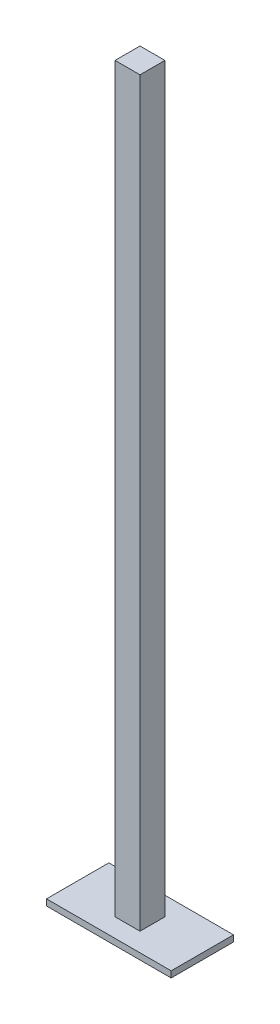
ISO-10303-21;
HEADER;
FILE_DESCRIPTION(('STEP AP214'),'2;1');
FILE_NAME('part.step','',(''),(''),'','','');
FILE_SCHEMA(('AUTOMOTIVE_DESIGN { 1 0 10303 214 1 1 1 1 }'));
ENDSEC;
DATA;
#1=APPLICATION_CONTEXT('core data for automotive mechanical design processes');
#2=APPLICATION_PROTOCOL_DEFINITION('international standard','automotive_design',2000,#1);
#3=PRODUCT_CONTEXT('',#1,'mechanical');
#4=PRODUCT('Part','Part','',(#3));
#5=PRODUCT_RELATED_PRODUCT_CATEGORY('part','',(#4));
#6=PRODUCT_DEFINITION_FORMATION('','',#4);
#7=PRODUCT_DEFINITION_CONTEXT('part definition',#1,'design');
#8=PRODUCT_DEFINITION('design','',#6,#7);
#9=PRODUCT_DEFINITION_SHAPE('','',#8);
#10=(LENGTH_UNIT() NAMED_UNIT(*) SI_UNIT(.MILLI.,.METRE.));
#11=(NAMED_UNIT(*) PLANE_ANGLE_UNIT() SI_UNIT($,.RADIAN.));
#12=(NAMED_UNIT(*) SI_UNIT($,.STERADIAN.) SOLID_ANGLE_UNIT());
#13=UNCERTAINTY_MEASURE_WITH_UNIT(LENGTH_MEASURE(1.E-05),#10,'distance_accuracy_value','');
#14=(GEOMETRIC_REPRESENTATION_CONTEXT(3) GLOBAL_UNCERTAINTY_ASSIGNED_CONTEXT((#13)) GLOBAL_UNIT_ASSIGNED_CONTEXT((#10,
#11,#12)) REPRESENTATION_CONTEXT('',''));
#15=CARTESIAN_POINT('',(0.,0.,0.));
#16=DIRECTION('',(0.,0.,1.));
#17=DIRECTION('',(1.,0.,0.));
#18=AXIS2_PLACEMENT_3D('',#15,#16,#17);
#19=CARTESIAN_POINT('',(-50.,5.,25.));
#20=DIRECTION('',(0.,1.,0.));
#21=DIRECTION('',(0.,0.,1.));
#22=AXIS2_PLACEMENT_3D('',#19,#20,#21);
#23=PLANE('',#22);
#24=DIRECTION('',(0.,0.,1.));
#25=VECTOR('',#24,1.);
#26=CARTESIAN_POINT('',(-50.,5.,-25.));
#27=LINE('',#26,#25);
#28=CARTESIAN_POINT('',(-50.,5.,-25.));
#29=VERTEX_POINT('',#28);
#30=CARTESIAN_POINT('',(-50.,5.,25.));
#31=VERTEX_POINT('',#30);
#32=EDGE_CURVE('E143',#29,#31,#27,.T.);
#33=ORIENTED_EDGE('',*,*,#32,.T.);
#34=DIRECTION('',(1.,0.,0.));
#35=VECTOR('',#34,1.);
#36=CARTESIAN_POINT('',(-50.,5.,25.));
#37=LINE('',#36,#35);
#38=CARTESIAN_POINT('',(50.,5.,25.));
#39=VERTEX_POINT('',#38);
#40=EDGE_CURVE('E83',#31,#39,#37,.T.);
#41=ORIENTED_EDGE('',*,*,#40,.T.);
#42=DIRECTION('',(0.,0.,-1.));
#43=VECTOR('',#42,1.);
#44=CARTESIAN_POINT('',(50.,5.,-25.));
#45=LINE('',#44,#43);
#46=CARTESIAN_POINT('',(50.,5.,-25.));
#47=VERTEX_POINT('',#46);
#48=EDGE_CURVE('E146',#39,#47,#45,.T.);
#49=ORIENTED_EDGE('',*,*,#48,.T.);
#50=DIRECTION('',(-1.,0.,0.));
#51=VECTOR('',#50,1.);
#52=CARTESIAN_POINT('',(-50.,5.,-25.));
#53=LINE('',#52,#51);
#54=EDGE_CURVE('E55',#47,#29,#53,.T.);
#55=ORIENTED_EDGE('',*,*,#54,.T.);
#56=EDGE_LOOP('',(#33,#41,#49,#55));
#57=FACE_BOUND('',#56,.T.);
#58=DIRECTION('',(-1.,0.,0.));
#59=VECTOR('',#58,1.);
#60=CARTESIAN_POINT('',(-50.,5.,10.));
#61=LINE('',#60,#59);
#62=CARTESIAN_POINT('',(10.,5.,10.));
#63=VERTEX_POINT('',#62);
#64=CARTESIAN_POINT('',(-10.,5.,10.));
#65=VERTEX_POINT('',#64);
#66=EDGE_CURVE('E139',#63,#65,#61,.T.);
#67=ORIENTED_EDGE('',*,*,#66,.T.);
#68=DIRECTION('',(0.,0.,-1.));
#69=VECTOR('',#68,1.);
#70=CARTESIAN_POINT('',(-10.,5.,25.));
#71=LINE('',#70,#69);
#72=CARTESIAN_POINT('',(-10.,5.,-10.));
#73=VERTEX_POINT('',#72);
#74=EDGE_CURVE('E128',#65,#73,#71,.T.);
#75=ORIENTED_EDGE('',*,*,#74,.T.);
#76=DIRECTION('',(1.,0.,0.));
#77=VECTOR('',#76,1.);
#78=CARTESIAN_POINT('',(-50.,5.,-10.));
#79=LINE('',#78,#77);
#80=CARTESIAN_POINT('',(10.,5.,-10.));
#81=VERTEX_POINT('',#80);
#82=EDGE_CURVE('E129',#73,#81,#79,.T.);
#83=ORIENTED_EDGE('',*,*,#82,.T.);
#84=DIRECTION('',(0.,0.,1.));
#85=VECTOR('',#84,1.);
#86=CARTESIAN_POINT('',(10.,5.,25.));
#87=LINE('',#86,#85);
#88=EDGE_CURVE('E132',#81,#63,#87,.T.);
#89=ORIENTED_EDGE('',*,*,#88,.T.);
#90=EDGE_LOOP('',(#67,#75,#83,#89));
#91=FACE_BOUND('',#90,.T.);
#92=ADVANCED_FACE('F31',(#57,#91),#23,.T.);
#93=CARTESIAN_POINT('',(-50.,5.,-25.));
#94=DIRECTION('',(1.,0.,0.));
#95=DIRECTION('',(0.,0.,-1.));
#96=AXIS2_PLACEMENT_3D('',#93,#94,#95);
#97=PLANE('',#96);
#98=DIRECTION('',(0.,0.,1.));
#99=VECTOR('',#98,1.);
#100=CARTESIAN_POINT('',(-50.,0.,-25.));
#101=LINE('',#100,#99);
#102=CARTESIAN_POINT('',(-50.,0.,-25.));
#103=VERTEX_POINT('',#102);
#104=CARTESIAN_POINT('',(-50.,0.,25.));
#105=VERTEX_POINT('',#104);
#106=EDGE_CURVE('E142',#103,#105,#101,.T.);
#107=ORIENTED_EDGE('',*,*,#106,.T.);
#108=DIRECTION('',(0.,-1.,0.));
#109=VECTOR('',#108,1.);
#110=CARTESIAN_POINT('',(-50.,5.,25.));
#111=LINE('',#110,#109);
#112=EDGE_CURVE('E11',#31,#105,#111,.T.);
#113=ORIENTED_EDGE('',*,*,#112,.F.);
#114=ORIENTED_EDGE('',*,*,#32,.F.);
#115=DIRECTION('',(0.,-1.,0.));
#116=VECTOR('',#115,1.);
#117=CARTESIAN_POINT('',(-50.,5.,-25.));
#118=LINE('',#117,#116);
#119=EDGE_CURVE('E149',#29,#103,#118,.T.);
#120=ORIENTED_EDGE('',*,*,#119,.T.);
#121=EDGE_LOOP('',(#107,#113,#114,#120));
#122=FACE_BOUND('',#121,.T.);
#123=ADVANCED_FACE('F33',(#122),#97,.F.);
#124=CARTESIAN_POINT('',(-50.,5.,25.));
#125=DIRECTION('',(0.,0.,-1.));
#126=DIRECTION('',(-1.,0.,0.));
#127=AXIS2_PLACEMENT_3D('',#124,#125,#126);
#128=PLANE('',#127);
#129=DIRECTION('',(1.,0.,0.));
#130=VECTOR('',#129,1.);
#131=CARTESIAN_POINT('',(-50.,0.,25.));
#132=LINE('',#131,#130);
#133=CARTESIAN_POINT('',(50.,0.,25.));
#134=VERTEX_POINT('',#133);
#135=EDGE_CURVE('E152',#105,#134,#132,.T.);
#136=ORIENTED_EDGE('',*,*,#135,.T.);
#137=DIRECTION('',(0.,-1.,0.));
#138=VECTOR('',#137,1.);
#139=CARTESIAN_POINT('',(50.,5.,25.));
#140=LINE('',#139,#138);
#141=EDGE_CURVE('E39',#39,#134,#140,.T.);
#142=ORIENTED_EDGE('',*,*,#141,.F.);
#143=ORIENTED_EDGE('',*,*,#40,.F.);
#144=ORIENTED_EDGE('',*,*,#112,.T.);
#145=EDGE_LOOP('',(#136,#142,#143,#144));
#146=FACE_BOUND('',#145,.T.);
#147=ADVANCED_FACE('F179',(#146),#128,.F.);
#148=CARTESIAN_POINT('',(50.,5.,-25.));
#149=DIRECTION('',(-1.,0.,0.));
#150=DIRECTION('',(0.,0.,1.));
#151=AXIS2_PLACEMENT_3D('',#148,#149,#150);
#152=PLANE('',#151);
#153=DIRECTION('',(0.,0.,-1.));
#154=VECTOR('',#153,1.);
#155=CARTESIAN_POINT('',(50.,0.,-25.));
#156=LINE('',#155,#154);
#157=CARTESIAN_POINT('',(50.,0.,-25.));
#158=VERTEX_POINT('',#157);
#159=EDGE_CURVE('E154',#134,#158,#156,.T.);
#160=ORIENTED_EDGE('',*,*,#159,.T.);
#161=DIRECTION('',(0.,-1.,0.));
#162=VECTOR('',#161,1.);
#163=CARTESIAN_POINT('',(50.,5.,-25.));
#164=LINE('',#163,#162);
#165=EDGE_CURVE('E158',#47,#158,#164,.T.);
#166=ORIENTED_EDGE('',*,*,#165,.F.);
#167=ORIENTED_EDGE('',*,*,#48,.F.);
#168=ORIENTED_EDGE('',*,*,#141,.T.);
#169=EDGE_LOOP('',(#160,#166,#167,#168));
#170=FACE_BOUND('',#169,.T.);
#171=ADVANCED_FACE('F163',(#170),#152,.F.);
#172=CARTESIAN_POINT('',(-50.,5.,-25.));
#173=DIRECTION('',(0.,0.,1.));
#174=DIRECTION('',(1.,0.,0.));
#175=AXIS2_PLACEMENT_3D('',#172,#173,#174);
#176=PLANE('',#175);
#177=DIRECTION('',(-1.,0.,0.));
#178=VECTOR('',#177,1.);
#179=CARTESIAN_POINT('',(-50.,0.,-25.));
#180=LINE('',#179,#178);
#181=EDGE_CURVE('E76',#158,#103,#180,.T.);
#182=ORIENTED_EDGE('',*,*,#181,.T.);
#183=ORIENTED_EDGE('',*,*,#119,.F.);
#184=ORIENTED_EDGE('',*,*,#54,.F.);
#185=ORIENTED_EDGE('',*,*,#165,.T.);
#186=EDGE_LOOP('',(#182,#183,#184,#185));
#187=FACE_BOUND('',#186,.T.);
#188=ADVANCED_FACE('F171',(#187),#176,.F.);
#189=CARTESIAN_POINT('',(-50.,0.,25.));
#190=DIRECTION('',(0.,1.,0.));
#191=DIRECTION('',(0.,0.,1.));
#192=AXIS2_PLACEMENT_3D('',#189,#190,#191);
#193=PLANE('',#192);
#194=ORIENTED_EDGE('',*,*,#106,.F.);
#195=ORIENTED_EDGE('',*,*,#181,.F.);
#196=ORIENTED_EDGE('',*,*,#159,.F.);
#197=ORIENTED_EDGE('',*,*,#135,.F.);
#198=EDGE_LOOP('',(#194,#195,#196,#197));
#199=FACE_BOUND('',#198,.T.);
#200=ADVANCED_FACE('F167',(#199),#193,.F.);
#201=CARTESIAN_POINT('',(-10.,600.,10.));
#202=DIRECTION('',(1.,0.,0.));
#203=DIRECTION('',(0.,0.,-1.));
#204=AXIS2_PLACEMENT_3D('',#201,#202,#203);
#205=PLANE('',#204);
#206=ORIENTED_EDGE('',*,*,#74,.F.);
#207=DIRECTION('',(0.,-1.,0.));
#208=VECTOR('',#207,1.);
#209=CARTESIAN_POINT('',(-10.,600.,10.));
#210=LINE('',#209,#208);
#211=CARTESIAN_POINT('',(-10.,600.,10.));
#212=VERTEX_POINT('',#211);
#213=EDGE_CURVE('E110',#212,#65,#210,.T.);
#214=ORIENTED_EDGE('',*,*,#213,.F.);
#215=DIRECTION('',(0.,0.,1.));
#216=VECTOR('',#215,1.);
#217=CARTESIAN_POINT('',(-10.,600.,10.));
#218=LINE('',#217,#216);
#219=CARTESIAN_POINT('',(-10.,600.,-10.));
#220=VERTEX_POINT('',#219);
#221=EDGE_CURVE('E117',#220,#212,#218,.T.);
#222=ORIENTED_EDGE('',*,*,#221,.F.);
#223=DIRECTION('',(0.,-1.,0.));
#224=VECTOR('',#223,1.);
#225=CARTESIAN_POINT('',(-10.,600.,-10.));
#226=LINE('',#225,#224);
#227=EDGE_CURVE('E263',#220,#73,#226,.T.);
#228=ORIENTED_EDGE('',*,*,#227,.T.);
#229=EDGE_LOOP('',(#206,#214,#222,#228));
#230=FACE_BOUND('',#229,.T.);
#231=ADVANCED_FACE('F126',(#230),#205,.F.);
#232=CARTESIAN_POINT('',(-10.,600.,10.));
#233=DIRECTION('',(0.,0.,-1.));
#234=DIRECTION('',(-1.,0.,0.));
#235=AXIS2_PLACEMENT_3D('',#232,#233,#234);
#236=PLANE('',#235);
#237=ORIENTED_EDGE('',*,*,#66,.F.);
#238=DIRECTION('',(0.,-1.,0.));
#239=VECTOR('',#238,1.);
#240=CARTESIAN_POINT('',(10.,600.,10.));
#241=LINE('',#240,#239);
#242=CARTESIAN_POINT('',(10.,600.,10.));
#243=VERTEX_POINT('',#242);
#244=EDGE_CURVE('E113',#243,#63,#241,.T.);
#245=ORIENTED_EDGE('',*,*,#244,.F.);
#246=DIRECTION('',(1.,0.,0.));
#247=VECTOR('',#246,1.);
#248=CARTESIAN_POINT('',(-10.,600.,10.));
#249=LINE('',#248,#247);
#250=EDGE_CURVE('E106',#212,#243,#249,.T.);
#251=ORIENTED_EDGE('',*,*,#250,.F.);
#252=ORIENTED_EDGE('',*,*,#213,.T.);
#253=EDGE_LOOP('',(#237,#245,#251,#252));
#254=FACE_BOUND('',#253,.T.);
#255=ADVANCED_FACE('F108',(#254),#236,.F.);
#256=CARTESIAN_POINT('',(10.,600.,10.));
#257=DIRECTION('',(-1.,0.,0.));
#258=DIRECTION('',(0.,0.,1.));
#259=AXIS2_PLACEMENT_3D('',#256,#257,#258);
#260=PLANE('',#259);
#261=ORIENTED_EDGE('',*,*,#88,.F.);
#262=DIRECTION('',(0.,-1.,0.));
#263=VECTOR('',#262,1.);
#264=CARTESIAN_POINT('',(10.,600.,-10.));
#265=LINE('',#264,#263);
#266=CARTESIAN_POINT('',(10.,600.,-10.));
#267=VERTEX_POINT('',#266);
#268=EDGE_CURVE('E46',#267,#81,#265,.T.);
#269=ORIENTED_EDGE('',*,*,#268,.F.);
#270=DIRECTION('',(0.,0.,-1.));
#271=VECTOR('',#270,1.);
#272=CARTESIAN_POINT('',(10.,600.,10.));
#273=LINE('',#272,#271);
#274=EDGE_CURVE('E116',#243,#267,#273,.T.);
#275=ORIENTED_EDGE('',*,*,#274,.F.);
#276=ORIENTED_EDGE('',*,*,#244,.T.);
#277=EDGE_LOOP('',(#261,#269,#275,#276));
#278=FACE_BOUND('',#277,.T.);
#279=ADVANCED_FACE('F192',(#278),#260,.F.);
#280=CARTESIAN_POINT('',(-10.,600.,-10.));
#281=DIRECTION('',(0.,0.,1.));
#282=DIRECTION('',(1.,0.,0.));
#283=AXIS2_PLACEMENT_3D('',#280,#281,#282);
#284=PLANE('',#283);
#285=ORIENTED_EDGE('',*,*,#82,.F.);
#286=ORIENTED_EDGE('',*,*,#227,.F.);
#287=DIRECTION('',(-1.,0.,0.));
#288=VECTOR('',#287,1.);
#289=CARTESIAN_POINT('',(-10.,600.,-10.));
#290=LINE('',#289,#288);
#291=EDGE_CURVE('E121',#267,#220,#290,.T.);
#292=ORIENTED_EDGE('',*,*,#291,.F.);
#293=ORIENTED_EDGE('',*,*,#268,.T.);
#294=EDGE_LOOP('',(#285,#286,#292,#293));
#295=FACE_BOUND('',#294,.T.);
#296=ADVANCED_FACE('F195',(#295),#284,.F.);
#297=CARTESIAN_POINT('',(-10.,600.,-10.));
#298=DIRECTION('',(0.,-1.,0.));
#299=DIRECTION('',(0.,0.,-1.));
#300=AXIS2_PLACEMENT_3D('',#297,#298,#299);
#301=PLANE('',#300);
#302=ORIENTED_EDGE('',*,*,#221,.T.);
#303=ORIENTED_EDGE('',*,*,#250,.T.);
#304=ORIENTED_EDGE('',*,*,#274,.T.);
#305=ORIENTED_EDGE('',*,*,#291,.T.);
#306=EDGE_LOOP('',(#302,#303,#304,#305));
#307=FACE_BOUND('',#306,.T.);
#308=ADVANCED_FACE('F120',(#307),#301,.F.);
#309=CLOSED_SHELL('',(#92,#123,#147,#171,#188,#200,#231,#255,#279,#296,#308));
#310=MANIFOLD_SOLID_BREP('B2',#309);
#311=ADVANCED_BREP_SHAPE_REPRESENTATION('',(#18,#310),#14);
#312=SHAPE_DEFINITION_REPRESENTATION(#9,#311);
ENDSEC;
END-ISO-10303-21;
